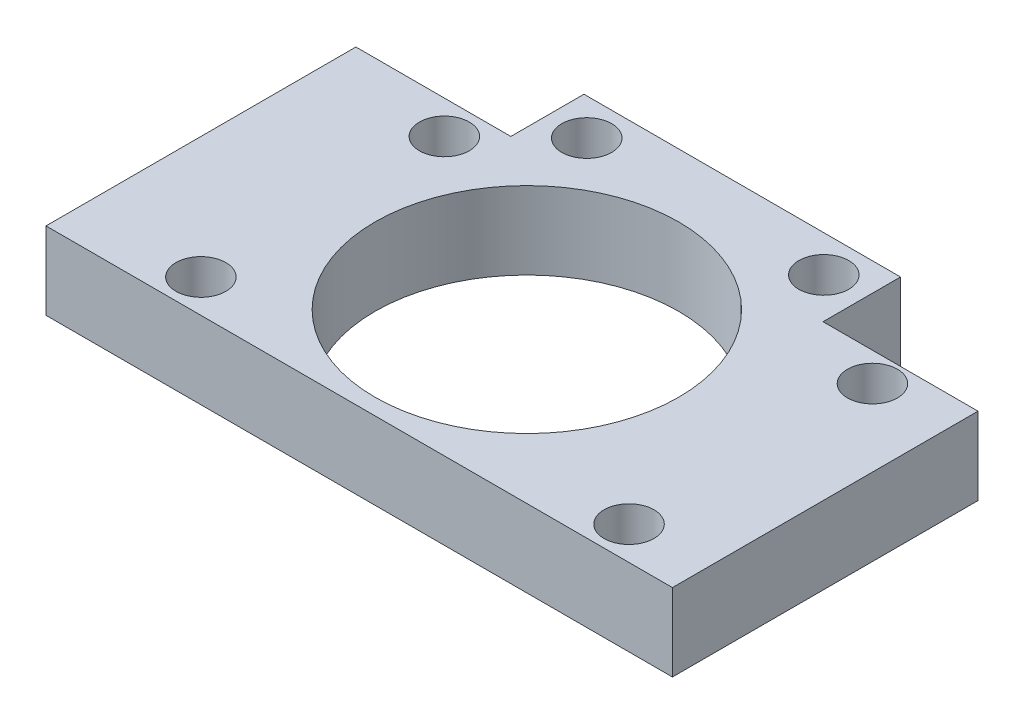
ISO-10303-21;
HEADER;
FILE_DESCRIPTION(('STEP AP214'),'2;1');
FILE_NAME('part.step','',(''),(''),'','','');
FILE_SCHEMA(('AUTOMOTIVE_DESIGN { 1 0 10303 214 1 1 1 1 }'));
ENDSEC;
DATA;
#1=APPLICATION_CONTEXT('core data for automotive mechanical design processes');
#2=APPLICATION_PROTOCOL_DEFINITION('international standard','automotive_design',2000,#1);
#3=PRODUCT_CONTEXT('',#1,'mechanical');
#4=PRODUCT('Part','Part','',(#3));
#5=PRODUCT_RELATED_PRODUCT_CATEGORY('part','',(#4));
#6=PRODUCT_DEFINITION_FORMATION('','',#4);
#7=PRODUCT_DEFINITION_CONTEXT('part definition',#1,'design');
#8=PRODUCT_DEFINITION('design','',#6,#7);
#9=PRODUCT_DEFINITION_SHAPE('','',#8);
#10=(LENGTH_UNIT() NAMED_UNIT(*) SI_UNIT(.MILLI.,.METRE.));
#11=(NAMED_UNIT(*) PLANE_ANGLE_UNIT() SI_UNIT($,.RADIAN.));
#12=(NAMED_UNIT(*) SI_UNIT($,.STERADIAN.) SOLID_ANGLE_UNIT());
#13=UNCERTAINTY_MEASURE_WITH_UNIT(LENGTH_MEASURE(1.E-05),#10,'distance_accuracy_value','');
#14=(GEOMETRIC_REPRESENTATION_CONTEXT(3) GLOBAL_UNCERTAINTY_ASSIGNED_CONTEXT((#13)) GLOBAL_UNIT_ASSIGNED_CONTEXT((#10,
#11,#12)) REPRESENTATION_CONTEXT('',''));
#15=CARTESIAN_POINT('',(0.,0.,0.));
#16=DIRECTION('',(0.,0.,1.));
#17=DIRECTION('',(1.,0.,0.));
#18=AXIS2_PLACEMENT_3D('',#15,#16,#17);
#19=CARTESIAN_POINT('',(10.2370109873311,2.5,0.));
#20=DIRECTION('',(1.,0.,0.));
#21=DIRECTION('',(0.,0.,-1.));
#22=AXIS2_PLACEMENT_3D('',#19,#20,#21);
#23=PLANE('',#22);
#24=DIRECTION('',(0.,0.,1.));
#25=VECTOR('',#24,1.);
#26=CARTESIAN_POINT('',(10.2370109873311,-2.5,0.));
#27=LINE('',#26,#25);
#28=CARTESIAN_POINT('',(10.2370109873311,-2.5,-11.9146905227743));
#29=VERTEX_POINT('',#28);
#30=CARTESIAN_POINT('',(10.2370109873311,-2.5,-6.91469052277429));
#31=VERTEX_POINT('',#30);
#32=EDGE_CURVE('E156',#29,#31,#27,.T.);
#33=ORIENTED_EDGE('',*,*,#32,.F.);
#34=DIRECTION('',(0.,-1.,0.));
#35=VECTOR('',#34,1.);
#36=CARTESIAN_POINT('',(10.2370109873311,2.5,-11.9146905227743));
#37=LINE('',#36,#35);
#38=CARTESIAN_POINT('',(10.2370109873311,2.5,-11.9146905227743));
#39=VERTEX_POINT('',#38);
#40=EDGE_CURVE('E11',#39,#29,#37,.T.);
#41=ORIENTED_EDGE('',*,*,#40,.F.);
#42=DIRECTION('',(0.,0.,1.));
#43=VECTOR('',#42,1.);
#44=CARTESIAN_POINT('',(10.2370109873311,2.5,0.));
#45=LINE('',#44,#43);
#46=CARTESIAN_POINT('',(10.2370109873311,2.5,-6.91469052277429));
#47=VERTEX_POINT('',#46);
#48=EDGE_CURVE('E197',#39,#47,#45,.T.);
#49=ORIENTED_EDGE('',*,*,#48,.T.);
#50=DIRECTION('',(0.,-1.,0.));
#51=VECTOR('',#50,1.);
#52=CARTESIAN_POINT('',(10.2370109873311,2.5,-6.91469052277429));
#53=LINE('',#52,#51);
#54=EDGE_CURVE('E57',#47,#31,#53,.T.);
#55=ORIENTED_EDGE('',*,*,#54,.T.);
#56=EDGE_LOOP('',(#33,#41,#49,#55));
#57=FACE_BOUND('',#56,.T.);
#58=ADVANCED_FACE('F41',(#57),#23,.T.);
#59=CARTESIAN_POINT('',(0.,2.5,-11.9146905227743));
#60=DIRECTION('',(0.,0.,-1.));
#61=DIRECTION('',(-1.,0.,0.));
#62=AXIS2_PLACEMENT_3D('',#59,#60,#61);
#63=PLANE('',#62);
#64=DIRECTION('',(1.,0.,0.));
#65=VECTOR('',#64,1.);
#66=CARTESIAN_POINT('',(0.,-2.5,-11.9146905227743));
#67=LINE('',#66,#65);
#68=CARTESIAN_POINT('',(-10.1929890126689,-2.5,-11.9146905227743));
#69=VERTEX_POINT('',#68);
#70=EDGE_CURVE('E158',#69,#29,#67,.T.);
#71=ORIENTED_EDGE('',*,*,#70,.F.);
#72=DIRECTION('',(0.,-1.,0.));
#73=VECTOR('',#72,1.);
#74=CARTESIAN_POINT('',(-10.1929890126689,2.5,-11.9146905227743));
#75=LINE('',#74,#73);
#76=CARTESIAN_POINT('',(-10.1929890126689,2.5,-11.9146905227743));
#77=VERTEX_POINT('',#76);
#78=EDGE_CURVE('E49',#77,#69,#75,.T.);
#79=ORIENTED_EDGE('',*,*,#78,.F.);
#80=DIRECTION('',(1.,0.,0.));
#81=VECTOR('',#80,1.);
#82=CARTESIAN_POINT('',(0.,2.5,-11.9146905227743));
#83=LINE('',#82,#81);
#84=EDGE_CURVE('E224',#77,#39,#83,.T.);
#85=ORIENTED_EDGE('',*,*,#84,.T.);
#86=ORIENTED_EDGE('',*,*,#40,.T.);
#87=EDGE_LOOP('',(#71,#79,#85,#86));
#88=FACE_BOUND('',#87,.T.);
#89=ADVANCED_FACE('F214',(#88),#63,.T.);
#90=CARTESIAN_POINT('',(-10.1929890126688,2.5,0.));
#91=DIRECTION('',(-1.,0.,0.));
#92=DIRECTION('',(0.,0.,1.));
#93=AXIS2_PLACEMENT_3D('',#90,#91,#92);
#94=PLANE('',#93);
#95=DIRECTION('',(0.,0.,-1.));
#96=VECTOR('',#95,1.);
#97=CARTESIAN_POINT('',(-10.1929890126688,-2.5,0.));
#98=LINE('',#97,#96);
#99=CARTESIAN_POINT('',(-10.1929890126689,-2.5,-7.19469052277429));
#100=VERTEX_POINT('',#99);
#101=EDGE_CURVE('E161',#100,#69,#98,.T.);
#102=ORIENTED_EDGE('',*,*,#101,.F.);
#103=DIRECTION('',(0.,-1.,0.));
#104=VECTOR('',#103,1.);
#105=CARTESIAN_POINT('',(-10.1929890126689,2.5,-7.19469052277429));
#106=LINE('',#105,#104);
#107=CARTESIAN_POINT('',(-10.1929890126689,2.5,-7.19469052277429));
#108=VERTEX_POINT('',#107);
#109=EDGE_CURVE('E203',#108,#100,#106,.T.);
#110=ORIENTED_EDGE('',*,*,#109,.F.);
#111=DIRECTION('',(0.,0.,-1.));
#112=VECTOR('',#111,1.);
#113=CARTESIAN_POINT('',(-10.1929890126688,2.5,0.));
#114=LINE('',#113,#112);
#115=EDGE_CURVE('E210',#108,#77,#114,.T.);
#116=ORIENTED_EDGE('',*,*,#115,.T.);
#117=ORIENTED_EDGE('',*,*,#78,.T.);
#118=EDGE_LOOP('',(#102,#110,#116,#117));
#119=FACE_BOUND('',#118,.T.);
#120=ADVANCED_FACE('F208',(#119),#94,.T.);
#121=CARTESIAN_POINT('',(0.,2.5,-7.19469052277429));
#122=DIRECTION('',(0.,0.,-1.));
#123=DIRECTION('',(-1.,0.,0.));
#124=AXIS2_PLACEMENT_3D('',#121,#122,#123);
#125=PLANE('',#124);
#126=DIRECTION('',(1.,0.,0.));
#127=VECTOR('',#126,1.);
#128=CARTESIAN_POINT('',(0.,-2.5,-7.19469052277429));
#129=LINE('',#128,#127);
#130=CARTESIAN_POINT('',(-20.1929890126689,-2.5,-7.19469052277429));
#131=VERTEX_POINT('',#130);
#132=EDGE_CURVE('E164',#131,#100,#129,.T.);
#133=ORIENTED_EDGE('',*,*,#132,.F.);
#134=DIRECTION('',(0.,-1.,0.));
#135=VECTOR('',#134,1.);
#136=CARTESIAN_POINT('',(-20.1929890126689,2.5,-7.19469052277429));
#137=LINE('',#136,#135);
#138=CARTESIAN_POINT('',(-20.1929890126689,2.5,-7.19469052277429));
#139=VERTEX_POINT('',#138);
#140=EDGE_CURVE('E201',#139,#131,#137,.T.);
#141=ORIENTED_EDGE('',*,*,#140,.F.);
#142=DIRECTION('',(1.,0.,0.));
#143=VECTOR('',#142,1.);
#144=CARTESIAN_POINT('',(0.,2.5,-7.19469052277429));
#145=LINE('',#144,#143);
#146=EDGE_CURVE('E223',#139,#108,#145,.T.);
#147=ORIENTED_EDGE('',*,*,#146,.T.);
#148=ORIENTED_EDGE('',*,*,#109,.T.);
#149=EDGE_LOOP('',(#133,#141,#147,#148));
#150=FACE_BOUND('',#149,.T.);
#151=ADVANCED_FACE('F221',(#150),#125,.T.);
#152=CARTESIAN_POINT('',(-20.1929890126689,2.5,0.));
#153=DIRECTION('',(1.,0.,0.));
#154=DIRECTION('',(0.,0.,-1.));
#155=AXIS2_PLACEMENT_3D('',#152,#153,#154);
#156=PLANE('',#155);
#157=DIRECTION('',(0.,0.,1.));
#158=VECTOR('',#157,1.);
#159=CARTESIAN_POINT('',(-20.1929890126689,-2.5,0.));
#160=LINE('',#159,#158);
#161=CARTESIAN_POINT('',(-20.1929890126689,-2.5,12.8053094772257));
#162=VERTEX_POINT('',#161);
#163=EDGE_CURVE('E167',#131,#162,#160,.T.);
#164=ORIENTED_EDGE('',*,*,#163,.T.);
#165=DIRECTION('',(0.,-1.,0.));
#166=VECTOR('',#165,1.);
#167=CARTESIAN_POINT('',(-20.1929890126689,2.5,12.8053094772257));
#168=LINE('',#167,#166);
#169=CARTESIAN_POINT('',(-20.1929890126689,2.5,12.8053094772257));
#170=VERTEX_POINT('',#169);
#171=EDGE_CURVE('E116',#170,#162,#168,.T.);
#172=ORIENTED_EDGE('',*,*,#171,.F.);
#173=DIRECTION('',(0.,0.,1.));
#174=VECTOR('',#173,1.);
#175=CARTESIAN_POINT('',(-20.1929890126689,2.5,0.));
#176=LINE('',#175,#174);
#177=EDGE_CURVE('E126',#139,#170,#176,.T.);
#178=ORIENTED_EDGE('',*,*,#177,.F.);
#179=ORIENTED_EDGE('',*,*,#140,.T.);
#180=EDGE_LOOP('',(#164,#172,#178,#179));
#181=FACE_BOUND('',#180,.T.);
#182=ADVANCED_FACE('F255',(#181),#156,.F.);
#183=CARTESIAN_POINT('',(0.,2.5,12.8053094772257));
#184=DIRECTION('',(0.,0.,1.));
#185=DIRECTION('',(1.,0.,0.));
#186=AXIS2_PLACEMENT_3D('',#183,#184,#185);
#187=PLANE('',#186);
#188=DIRECTION('',(-1.,0.,0.));
#189=VECTOR('',#188,1.);
#190=CARTESIAN_POINT('',(0.,-2.5,12.8053094772257));
#191=LINE('',#190,#189);
#192=CARTESIAN_POINT('',(20.2370109873311,-2.5,12.8053094772257));
#193=VERTEX_POINT('',#192);
#194=EDGE_CURVE('E112',#193,#162,#191,.T.);
#195=ORIENTED_EDGE('',*,*,#194,.F.);
#196=DIRECTION('',(0.,-1.,0.));
#197=VECTOR('',#196,1.);
#198=CARTESIAN_POINT('',(20.2370109873311,2.5,12.8053094772257));
#199=LINE('',#198,#197);
#200=CARTESIAN_POINT('',(20.2370109873311,2.5,12.8053094772257));
#201=VERTEX_POINT('',#200);
#202=EDGE_CURVE('E107',#201,#193,#199,.T.);
#203=ORIENTED_EDGE('',*,*,#202,.F.);
#204=DIRECTION('',(-1.,0.,0.));
#205=VECTOR('',#204,1.);
#206=CARTESIAN_POINT('',(0.,2.5,12.8053094772257));
#207=LINE('',#206,#205);
#208=EDGE_CURVE('E110',#201,#170,#207,.T.);
#209=ORIENTED_EDGE('',*,*,#208,.T.);
#210=ORIENTED_EDGE('',*,*,#171,.T.);
#211=EDGE_LOOP('',(#195,#203,#209,#210));
#212=FACE_BOUND('',#211,.T.);
#213=ADVANCED_FACE('F109',(#212),#187,.T.);
#214=CARTESIAN_POINT('',(20.2370109873311,2.5,0.));
#215=DIRECTION('',(1.,0.,0.));
#216=DIRECTION('',(0.,0.,-1.));
#217=AXIS2_PLACEMENT_3D('',#214,#215,#216);
#218=PLANE('',#217);
#219=DIRECTION('',(0.,0.,1.));
#220=VECTOR('',#219,1.);
#221=CARTESIAN_POINT('',(20.2370109873311,-2.5,0.));
#222=LINE('',#221,#220);
#223=CARTESIAN_POINT('',(20.2370109873311,-2.5,-6.91469052277429));
#224=VERTEX_POINT('',#223);
#225=EDGE_CURVE('E171',#224,#193,#222,.T.);
#226=ORIENTED_EDGE('',*,*,#225,.F.);
#227=DIRECTION('',(0.,-1.,0.));
#228=VECTOR('',#227,1.);
#229=CARTESIAN_POINT('',(20.2370109873311,2.5,-6.91469052277429));
#230=LINE('',#229,#228);
#231=CARTESIAN_POINT('',(20.2370109873311,2.5,-6.91469052277429));
#232=VERTEX_POINT('',#231);
#233=EDGE_CURVE('E82',#232,#224,#230,.T.);
#234=ORIENTED_EDGE('',*,*,#233,.F.);
#235=DIRECTION('',(0.,0.,1.));
#236=VECTOR('',#235,1.);
#237=CARTESIAN_POINT('',(20.2370109873311,2.5,0.));
#238=LINE('',#237,#236);
#239=EDGE_CURVE('E123',#232,#201,#238,.T.);
#240=ORIENTED_EDGE('',*,*,#239,.T.);
#241=ORIENTED_EDGE('',*,*,#202,.T.);
#242=EDGE_LOOP('',(#226,#234,#240,#241));
#243=FACE_BOUND('',#242,.T.);
#244=ADVANCED_FACE('F129',(#243),#218,.T.);
#245=CARTESIAN_POINT('',(15.2901081666769,2.5,-5.04969052277429));
#246=DIRECTION('',(0.,-1.,0.));
#247=DIRECTION('',(0.,0.,-1.));
#248=AXIS2_PLACEMENT_3D('',#245,#246,#247);
#249=CYLINDRICAL_SURFACE('',#248,1.61000000000001);
#250=CARTESIAN_POINT('',(15.2901081666769,2.5,-5.04969052277429));
#251=DIRECTION('',(0.,1.,0.));
#252=DIRECTION('',(0.,0.,1.));
#253=AXIS2_PLACEMENT_3D('',#250,#251,#252);
#254=CIRCLE('',#253,1.61000000000001);
#255=CARTESIAN_POINT('',(15.2901081666769,2.5,-3.43969052277429));
#256=VERTEX_POINT('',#255);
#257=EDGE_CURVE('E150',#256,#256,#254,.T.);
#258=ORIENTED_EDGE('',*,*,#257,.T.);
#259=EDGE_LOOP('',(#258));
#260=FACE_BOUND('',#259,.T.);
#261=CARTESIAN_POINT('',(15.2901081666769,-2.5,-5.04969052277429));
#262=DIRECTION('',(0.,1.,0.));
#263=DIRECTION('',(0.,0.,1.));
#264=AXIS2_PLACEMENT_3D('',#261,#262,#263);
#265=CIRCLE('',#264,1.61000000000001);
#266=CARTESIAN_POINT('',(15.2901081666769,-2.5,-3.43969052277429));
#267=VERTEX_POINT('',#266);
#268=EDGE_CURVE('E191',#267,#267,#265,.T.);
#269=ORIENTED_EDGE('',*,*,#268,.F.);
#270=EDGE_LOOP('',(#269));
#271=FACE_BOUND('',#270,.T.);
#272=ADVANCED_FACE('F261',(#260,#271),#249,.F.);
#273=CARTESIAN_POINT('',(7.64576839590492,2.5,-9.55353549817908));
#274=DIRECTION('',(0.,-1.,0.));
#275=DIRECTION('',(0.,0.,-1.));
#276=AXIS2_PLACEMENT_3D('',#273,#274,#275);
#277=CYLINDRICAL_SURFACE('',#276,1.61029889540952);
#278=CARTESIAN_POINT('',(7.64576839590492,2.5,-9.55353549817908));
#279=DIRECTION('',(0.,1.,0.));
#280=DIRECTION('',(0.,0.,1.));
#281=AXIS2_PLACEMENT_3D('',#278,#279,#280);
#282=CIRCLE('',#281,1.61029889540952);
#283=CARTESIAN_POINT('',(7.64576839590492,2.5,-7.94323660276957));
#284=VERTEX_POINT('',#283);
#285=EDGE_CURVE('E147',#284,#284,#282,.T.);
#286=ORIENTED_EDGE('',*,*,#285,.T.);
#287=EDGE_LOOP('',(#286));
#288=FACE_BOUND('',#287,.T.);
#289=CARTESIAN_POINT('',(7.64576839590492,-2.5,-9.55353549817908));
#290=DIRECTION('',(0.,1.,0.));
#291=DIRECTION('',(0.,0.,1.));
#292=AXIS2_PLACEMENT_3D('',#289,#290,#291);
#293=CIRCLE('',#292,1.61029889540952);
#294=CARTESIAN_POINT('',(7.64576839590492,-2.5,-7.94323660276957));
#295=VERTEX_POINT('',#294);
#296=EDGE_CURVE('E188',#295,#295,#293,.T.);
#297=ORIENTED_EDGE('',*,*,#296,.F.);
#298=EDGE_LOOP('',(#297));
#299=FACE_BOUND('',#298,.T.);
#300=ADVANCED_FACE('F265',(#288,#299),#277,.F.);
#301=CARTESIAN_POINT('',(-7.65376201202699,2.5,-9.55353549817908));
#302=DIRECTION('',(0.,-1.,0.));
#303=DIRECTION('',(0.,0.,-1.));
#304=AXIS2_PLACEMENT_3D('',#301,#302,#303);
#305=CYLINDRICAL_SURFACE('',#304,1.61029889540952);
#306=CARTESIAN_POINT('',(-7.65376201202699,2.5,-9.55353549817908));
#307=DIRECTION('',(0.,1.,0.));
#308=DIRECTION('',(0.,0.,1.));
#309=AXIS2_PLACEMENT_3D('',#306,#307,#308);
#310=CIRCLE('',#309,1.61029889540952);
#311=CARTESIAN_POINT('',(-7.65376201202699,2.5,-7.94323660276957));
#312=VERTEX_POINT('',#311);
#313=EDGE_CURVE('E144',#312,#312,#310,.T.);
#314=ORIENTED_EDGE('',*,*,#313,.T.);
#315=EDGE_LOOP('',(#314));
#316=FACE_BOUND('',#315,.T.);
#317=CARTESIAN_POINT('',(-7.65376201202699,-2.5,-9.55353549817908));
#318=DIRECTION('',(0.,1.,0.));
#319=DIRECTION('',(0.,0.,1.));
#320=AXIS2_PLACEMENT_3D('',#317,#318,#319);
#321=CIRCLE('',#320,1.61029889540952);
#322=CARTESIAN_POINT('',(-7.65376201202699,-2.5,-7.94323660276957));
#323=VERTEX_POINT('',#322);
#324=EDGE_CURVE('E185',#323,#323,#321,.T.);
#325=ORIENTED_EDGE('',*,*,#324,.F.);
#326=EDGE_LOOP('',(#325));
#327=FACE_BOUND('',#326,.T.);
#328=ADVANCED_FACE('F271',(#316,#327),#305,.F.);
#329=CARTESIAN_POINT('',(-12.3398918333231,2.5,-5.04969052277429));
#330=DIRECTION('',(0.,-1.,0.));
#331=DIRECTION('',(0.,0.,-1.));
#332=AXIS2_PLACEMENT_3D('',#329,#330,#331);
#333=CYLINDRICAL_SURFACE('',#332,1.61);
#334=CARTESIAN_POINT('',(-12.3398918333231,2.5,-5.04969052277429));
#335=DIRECTION('',(0.,1.,0.));
#336=DIRECTION('',(0.,0.,1.));
#337=AXIS2_PLACEMENT_3D('',#334,#335,#336);
#338=CIRCLE('',#337,1.61);
#339=CARTESIAN_POINT('',(-12.3398918333231,2.5,-3.43969052277429));
#340=VERTEX_POINT('',#339);
#341=EDGE_CURVE('E141',#340,#340,#338,.T.);
#342=ORIENTED_EDGE('',*,*,#341,.T.);
#343=EDGE_LOOP('',(#342));
#344=FACE_BOUND('',#343,.T.);
#345=CARTESIAN_POINT('',(-12.3398918333231,-2.5,-5.04969052277429));
#346=DIRECTION('',(0.,1.,0.));
#347=DIRECTION('',(0.,0.,1.));
#348=AXIS2_PLACEMENT_3D('',#345,#346,#347);
#349=CIRCLE('',#348,1.61);
#350=CARTESIAN_POINT('',(-12.3398918333231,-2.5,-3.43969052277429));
#351=VERTEX_POINT('',#350);
#352=EDGE_CURVE('E182',#351,#351,#349,.T.);
#353=ORIENTED_EDGE('',*,*,#352,.F.);
#354=EDGE_LOOP('',(#353));
#355=FACE_BOUND('',#354,.T.);
#356=ADVANCED_FACE('F279',(#344,#355),#333,.F.);
#357=CARTESIAN_POINT('',(-12.3398918333231,2.5,10.6605087408321));
#358=DIRECTION('',(0.,-1.,0.));
#359=DIRECTION('',(0.,0.,-1.));
#360=AXIS2_PLACEMENT_3D('',#357,#358,#359);
#361=CYLINDRICAL_SURFACE('',#360,1.61019926360635);
#362=CARTESIAN_POINT('',(-12.3398918333231,2.5,10.6605087408321));
#363=DIRECTION('',(0.,1.,0.));
#364=DIRECTION('',(0.,0.,1.));
#365=AXIS2_PLACEMENT_3D('',#362,#363,#364);
#366=CIRCLE('',#365,1.61019926360635);
#367=CARTESIAN_POINT('',(-12.3398918333231,2.5,12.2707080044384));
#368=VERTEX_POINT('',#367);
#369=EDGE_CURVE('E138',#368,#368,#366,.T.);
#370=ORIENTED_EDGE('',*,*,#369,.T.);
#371=EDGE_LOOP('',(#370));
#372=FACE_BOUND('',#371,.T.);
#373=CARTESIAN_POINT('',(-12.3398918333231,-2.5,10.6605087408321));
#374=DIRECTION('',(0.,1.,0.));
#375=DIRECTION('',(0.,0.,1.));
#376=AXIS2_PLACEMENT_3D('',#373,#374,#375);
#377=CIRCLE('',#376,1.61019926360635);
#378=CARTESIAN_POINT('',(-12.3398918333231,-2.5,12.2707080044384));
#379=VERTEX_POINT('',#378);
#380=EDGE_CURVE('E179',#379,#379,#377,.T.);
#381=ORIENTED_EDGE('',*,*,#380,.F.);
#382=EDGE_LOOP('',(#381));
#383=FACE_BOUND('',#382,.T.);
#384=ADVANCED_FACE('F240',(#372,#383),#361,.F.);
#385=CARTESIAN_POINT('',(0.,2.5,1.96530947722571));
#386=DIRECTION('',(0.,-1.,0.));
#387=DIRECTION('',(0.,0.,-1.));
#388=AXIS2_PLACEMENT_3D('',#385,#386,#387);
#389=CYLINDRICAL_SURFACE('',#388,9.8);
#390=CARTESIAN_POINT('',(0.,2.5,1.96530947722571));
#391=DIRECTION('',(0.,1.,0.));
#392=DIRECTION('',(0.,0.,1.));
#393=AXIS2_PLACEMENT_3D('',#390,#391,#392);
#394=CIRCLE('',#393,9.8);
#395=CARTESIAN_POINT('',(0.,2.5,11.7653094772257));
#396=VERTEX_POINT('',#395);
#397=EDGE_CURVE('E132',#396,#396,#394,.T.);
#398=ORIENTED_EDGE('',*,*,#397,.T.);
#399=EDGE_LOOP('',(#398));
#400=FACE_BOUND('',#399,.T.);
#401=CARTESIAN_POINT('',(0.,-2.5,1.96530947722571));
#402=DIRECTION('',(0.,1.,0.));
#403=DIRECTION('',(0.,0.,1.));
#404=AXIS2_PLACEMENT_3D('',#401,#402,#403);
#405=CIRCLE('',#404,9.8);
#406=CARTESIAN_POINT('',(0.,-2.5,11.7653094772257));
#407=VERTEX_POINT('',#406);
#408=EDGE_CURVE('E176',#407,#407,#405,.T.);
#409=ORIENTED_EDGE('',*,*,#408,.F.);
#410=EDGE_LOOP('',(#409));
#411=FACE_BOUND('',#410,.T.);
#412=ADVANCED_FACE('F232',(#400,#411),#389,.F.);
#413=CARTESIAN_POINT('',(0.,2.5,-6.91469052277429));
#414=DIRECTION('',(0.,0.,-1.));
#415=DIRECTION('',(-1.,0.,0.));
#416=AXIS2_PLACEMENT_3D('',#413,#414,#415);
#417=PLANE('',#416);
#418=DIRECTION('',(1.,0.,0.));
#419=VECTOR('',#418,1.);
#420=CARTESIAN_POINT('',(0.,-2.5,-6.91469052277429));
#421=LINE('',#420,#419);
#422=EDGE_CURVE('E173',#31,#224,#421,.T.);
#423=ORIENTED_EDGE('',*,*,#422,.F.);
#424=ORIENTED_EDGE('',*,*,#54,.F.);
#425=DIRECTION('',(1.,0.,0.));
#426=VECTOR('',#425,1.);
#427=CARTESIAN_POINT('',(0.,2.5,-6.91469052277429));
#428=LINE('',#427,#426);
#429=EDGE_CURVE('E130',#47,#232,#428,.T.);
#430=ORIENTED_EDGE('',*,*,#429,.T.);
#431=ORIENTED_EDGE('',*,*,#233,.T.);
#432=EDGE_LOOP('',(#423,#424,#430,#431));
#433=FACE_BOUND('',#432,.T.);
#434=ADVANCED_FACE('F229',(#433),#417,.T.);
#435=CARTESIAN_POINT('',(15.2901081666769,2.5,10.6606083726352));
#436=DIRECTION('',(0.,-1.,0.));
#437=DIRECTION('',(0.,0.,-1.));
#438=AXIS2_PLACEMENT_3D('',#435,#436,#437);
#439=CYLINDRICAL_SURFACE('',#438,1.61029889540952);
#440=CARTESIAN_POINT('',(15.2901081666769,2.5,10.6606083726352));
#441=DIRECTION('',(0.,1.,0.));
#442=DIRECTION('',(0.,0.,1.));
#443=AXIS2_PLACEMENT_3D('',#440,#441,#442);
#444=CIRCLE('',#443,1.61029889540952);
#445=CARTESIAN_POINT('',(15.2901081666769,2.5,12.2709072680447));
#446=VERTEX_POINT('',#445);
#447=EDGE_CURVE('E153',#446,#446,#444,.T.);
#448=ORIENTED_EDGE('',*,*,#447,.T.);
#449=EDGE_LOOP('',(#448));
#450=FACE_BOUND('',#449,.T.);
#451=CARTESIAN_POINT('',(15.2901081666769,-2.5,10.6606083726352));
#452=DIRECTION('',(0.,1.,0.));
#453=DIRECTION('',(0.,0.,1.));
#454=AXIS2_PLACEMENT_3D('',#451,#452,#453);
#455=CIRCLE('',#454,1.61029889540952);
#456=CARTESIAN_POINT('',(15.2901081666769,-2.5,12.2709072680447));
#457=VERTEX_POINT('',#456);
#458=EDGE_CURVE('E194',#457,#457,#455,.T.);
#459=ORIENTED_EDGE('',*,*,#458,.F.);
#460=EDGE_LOOP('',(#459));
#461=FACE_BOUND('',#460,.T.);
#462=ADVANCED_FACE('F231',(#450,#461),#439,.F.);
#463=CARTESIAN_POINT('',(0.,2.5,0.));
#464=DIRECTION('',(0.,1.,0.));
#465=DIRECTION('',(0.,0.,1.));
#466=AXIS2_PLACEMENT_3D('',#463,#464,#465);
#467=PLANE('',#466);
#468=ORIENTED_EDGE('',*,*,#48,.F.);
#469=ORIENTED_EDGE('',*,*,#84,.F.);
#470=ORIENTED_EDGE('',*,*,#115,.F.);
#471=ORIENTED_EDGE('',*,*,#146,.F.);
#472=ORIENTED_EDGE('',*,*,#177,.T.);
#473=ORIENTED_EDGE('',*,*,#208,.F.);
#474=ORIENTED_EDGE('',*,*,#239,.F.);
#475=ORIENTED_EDGE('',*,*,#429,.F.);
#476=EDGE_LOOP('',(#468,#469,#470,#471,#472,#473,#474,#475));
#477=FACE_BOUND('',#476,.T.);
#478=ORIENTED_EDGE('',*,*,#397,.F.);
#479=EDGE_LOOP('',(#478));
#480=FACE_BOUND('',#479,.T.);
#481=ORIENTED_EDGE('',*,*,#369,.F.);
#482=EDGE_LOOP('',(#481));
#483=FACE_BOUND('',#482,.T.);
#484=ORIENTED_EDGE('',*,*,#341,.F.);
#485=EDGE_LOOP('',(#484));
#486=FACE_BOUND('',#485,.T.);
#487=ORIENTED_EDGE('',*,*,#313,.F.);
#488=EDGE_LOOP('',(#487));
#489=FACE_BOUND('',#488,.T.);
#490=ORIENTED_EDGE('',*,*,#285,.F.);
#491=EDGE_LOOP('',(#490));
#492=FACE_BOUND('',#491,.T.);
#493=ORIENTED_EDGE('',*,*,#257,.F.);
#494=EDGE_LOOP('',(#493));
#495=FACE_BOUND('',#494,.T.);
#496=ORIENTED_EDGE('',*,*,#447,.F.);
#497=EDGE_LOOP('',(#496));
#498=FACE_BOUND('',#497,.T.);
#499=ADVANCED_FACE('F120',(#477,#480,#483,#486,#489,#492,#495,#498),#467,.T.);
#500=CARTESIAN_POINT('',(0.,-2.5,0.));
#501=DIRECTION('',(0.,1.,0.));
#502=DIRECTION('',(0.,0.,1.));
#503=AXIS2_PLACEMENT_3D('',#500,#501,#502);
#504=PLANE('',#503);
#505=ORIENTED_EDGE('',*,*,#32,.T.);
#506=ORIENTED_EDGE('',*,*,#422,.T.);
#507=ORIENTED_EDGE('',*,*,#225,.T.);
#508=ORIENTED_EDGE('',*,*,#194,.T.);
#509=ORIENTED_EDGE('',*,*,#163,.F.);
#510=ORIENTED_EDGE('',*,*,#132,.T.);
#511=ORIENTED_EDGE('',*,*,#101,.T.);
#512=ORIENTED_EDGE('',*,*,#70,.T.);
#513=EDGE_LOOP('',(#505,#506,#507,#508,#509,#510,#511,#512));
#514=FACE_BOUND('',#513,.T.);
#515=ORIENTED_EDGE('',*,*,#408,.T.);
#516=EDGE_LOOP('',(#515));
#517=FACE_BOUND('',#516,.T.);
#518=ORIENTED_EDGE('',*,*,#380,.T.);
#519=EDGE_LOOP('',(#518));
#520=FACE_BOUND('',#519,.T.);
#521=ORIENTED_EDGE('',*,*,#352,.T.);
#522=EDGE_LOOP('',(#521));
#523=FACE_BOUND('',#522,.T.);
#524=ORIENTED_EDGE('',*,*,#324,.T.);
#525=EDGE_LOOP('',(#524));
#526=FACE_BOUND('',#525,.T.);
#527=ORIENTED_EDGE('',*,*,#296,.T.);
#528=EDGE_LOOP('',(#527));
#529=FACE_BOUND('',#528,.T.);
#530=ORIENTED_EDGE('',*,*,#268,.T.);
#531=EDGE_LOOP('',(#530));
#532=FACE_BOUND('',#531,.T.);
#533=ORIENTED_EDGE('',*,*,#458,.T.);
#534=EDGE_LOOP('',(#533));
#535=FACE_BOUND('',#534,.T.);
#536=ADVANCED_FACE('F216',(#514,#517,#520,#523,#526,#529,#532,#535),#504,.F.);
#537=CLOSED_SHELL('',(#58,#89,#120,#151,#182,#213,#244,#272,#300,#328,#356,#384,#412,#434,#462,
#499,#536));
#538=MANIFOLD_SOLID_BREP('B2',#537);
#539=ADVANCED_BREP_SHAPE_REPRESENTATION('',(#18,#538),#14);
#540=SHAPE_DEFINITION_REPRESENTATION(#9,#539);
ENDSEC;
END-ISO-10303-21;
